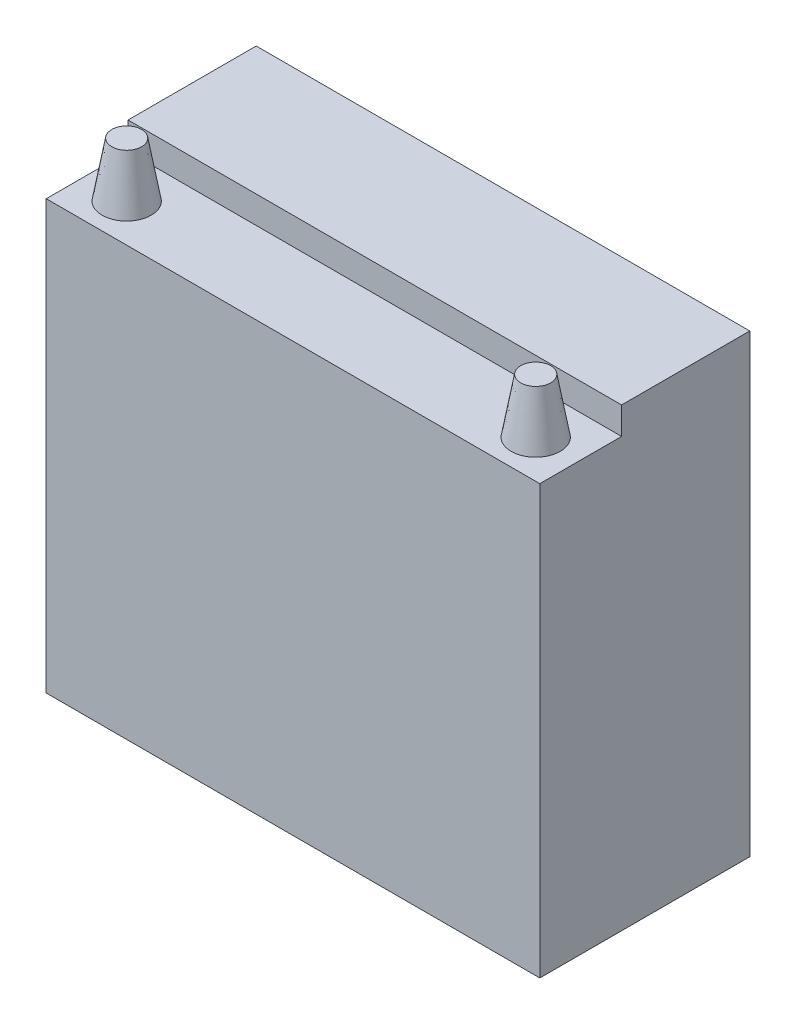
ISO-10303-21;
HEADER;
FILE_DESCRIPTION(('STEP AP214'),'2;1');
FILE_NAME('part.step','',(''),(''),'','','');
FILE_SCHEMA(('AUTOMOTIVE_DESIGN { 1 0 10303 214 1 1 1 1 }'));
ENDSEC;
DATA;
#1=APPLICATION_CONTEXT('core data for automotive mechanical design processes');
#2=APPLICATION_PROTOCOL_DEFINITION('international standard','automotive_design',2000,#1);
#3=PRODUCT_CONTEXT('',#1,'mechanical');
#4=PRODUCT('Part','Part','',(#3));
#5=PRODUCT_RELATED_PRODUCT_CATEGORY('part','',(#4));
#6=PRODUCT_DEFINITION_FORMATION('','',#4);
#7=PRODUCT_DEFINITION_CONTEXT('part definition',#1,'design');
#8=PRODUCT_DEFINITION('design','',#6,#7);
#9=PRODUCT_DEFINITION_SHAPE('','',#8);
#10=(LENGTH_UNIT() NAMED_UNIT(*) SI_UNIT(.MILLI.,.METRE.));
#11=(NAMED_UNIT(*) PLANE_ANGLE_UNIT() SI_UNIT($,.RADIAN.));
#12=(NAMED_UNIT(*) SI_UNIT($,.STERADIAN.) SOLID_ANGLE_UNIT());
#13=UNCERTAINTY_MEASURE_WITH_UNIT(LENGTH_MEASURE(1.E-05),#10,'distance_accuracy_value','');
#14=(GEOMETRIC_REPRESENTATION_CONTEXT(3) GLOBAL_UNCERTAINTY_ASSIGNED_CONTEXT((#13)) GLOBAL_UNIT_ASSIGNED_CONTEXT((#10,
#11,#12)) REPRESENTATION_CONTEXT('',''));
#15=CARTESIAN_POINT('',(0.,0.,0.));
#16=DIRECTION('',(0.,0.,1.));
#17=DIRECTION('',(1.,0.,0.));
#18=AXIS2_PLACEMENT_3D('',#15,#16,#17);
#19=CARTESIAN_POINT('',(-77.,167.,31.8307086614173));
#20=DIRECTION('',(1.,0.,0.));
#21=DIRECTION('',(0.,0.,-1.));
#22=AXIS2_PLACEMENT_3D('',#19,#20,#21);
#23=PLANE('',#22);
#24=DIRECTION('',(0.,0.,1.));
#25=VECTOR('',#24,1.);
#26=CARTESIAN_POINT('',(-77.,157.,31.8307086614173));
#27=LINE('',#26,#25);
#28=CARTESIAN_POINT('',(-77.,157.,1.83070866141732));
#29=VERTEX_POINT('',#28);
#30=CARTESIAN_POINT('',(-77.,157.,31.8307086614173));
#31=VERTEX_POINT('',#30);
#32=EDGE_CURVE('E127',#29,#31,#27,.T.);
#33=ORIENTED_EDGE('',*,*,#32,.F.);
#34=DIRECTION('',(0.,1.,0.));
#35=VECTOR('',#34,1.);
#36=CARTESIAN_POINT('',(-77.,157.,1.83070866141732));
#37=LINE('',#36,#35);
#38=CARTESIAN_POINT('',(-77.,167.,1.83070866141732));
#39=VERTEX_POINT('',#38);
#40=EDGE_CURVE('E100',#29,#39,#37,.T.);
#41=ORIENTED_EDGE('',*,*,#40,.T.);
#42=DIRECTION('',(0.,0.,1.));
#43=VECTOR('',#42,1.);
#44=CARTESIAN_POINT('',(-77.,167.,31.8307086614173));
#45=LINE('',#44,#43);
#46=CARTESIAN_POINT('',(-77.,167.,-45.1692913385827));
#47=VERTEX_POINT('',#46);
#48=EDGE_CURVE('E86',#47,#39,#45,.T.);
#49=ORIENTED_EDGE('',*,*,#48,.F.);
#50=DIRECTION('',(0.,-1.,0.));
#51=VECTOR('',#50,1.);
#52=CARTESIAN_POINT('',(-77.,167.,-45.1692913385827));
#53=LINE('',#52,#51);
#54=CARTESIAN_POINT('',(-77.,0.,-45.1692913385827));
#55=VERTEX_POINT('',#54);
#56=EDGE_CURVE('E79',#47,#55,#53,.T.);
#57=ORIENTED_EDGE('',*,*,#56,.T.);
#58=DIRECTION('',(0.,0.,1.));
#59=VECTOR('',#58,1.);
#60=CARTESIAN_POINT('',(-77.,0.,31.8307086614173));
#61=LINE('',#60,#59);
#62=CARTESIAN_POINT('',(-77.,0.,31.8307086614173));
#63=VERTEX_POINT('',#62);
#64=EDGE_CURVE('E93',#55,#63,#61,.T.);
#65=ORIENTED_EDGE('',*,*,#64,.T.);
#66=DIRECTION('',(0.,-1.,0.));
#67=VECTOR('',#66,1.);
#68=CARTESIAN_POINT('',(-77.,167.,31.8307086614173));
#69=LINE('',#68,#67);
#70=EDGE_CURVE('E111',#31,#63,#69,.T.);
#71=ORIENTED_EDGE('',*,*,#70,.F.);
#72=EDGE_LOOP('',(#33,#41,#49,#57,#65,#71));
#73=FACE_BOUND('',#72,.T.);
#74=ADVANCED_FACE('F34',(#73),#23,.F.);
#75=CARTESIAN_POINT('',(-77.,167.,31.8307086614173));
#76=DIRECTION('',(0.,0.,-1.));
#77=DIRECTION('',(-1.,0.,0.));
#78=AXIS2_PLACEMENT_3D('',#75,#76,#77);
#79=PLANE('',#78);
#80=DIRECTION('',(0.,-1.,0.));
#81=VECTOR('',#80,1.);
#82=CARTESIAN_POINT('',(104.,167.,31.8307086614173));
#83=LINE('',#82,#81);
#84=CARTESIAN_POINT('',(104.,157.,31.8307086614173));
#85=VERTEX_POINT('',#84);
#86=CARTESIAN_POINT('',(104.,0.,31.8307086614173));
#87=VERTEX_POINT('',#86);
#88=EDGE_CURVE('E109',#85,#87,#83,.T.);
#89=ORIENTED_EDGE('',*,*,#88,.F.);
#90=DIRECTION('',(1.,0.,0.));
#91=VECTOR('',#90,1.);
#92=CARTESIAN_POINT('',(-77.,157.,31.8307086614173));
#93=LINE('',#92,#91);
#94=EDGE_CURVE('E131',#31,#85,#93,.T.);
#95=ORIENTED_EDGE('',*,*,#94,.F.);
#96=ORIENTED_EDGE('',*,*,#70,.T.);
#97=DIRECTION('',(1.,0.,0.));
#98=VECTOR('',#97,1.);
#99=CARTESIAN_POINT('',(-77.,0.,31.8307086614173));
#100=LINE('',#99,#98);
#101=EDGE_CURVE('E99',#63,#87,#100,.T.);
#102=ORIENTED_EDGE('',*,*,#101,.T.);
#103=EDGE_LOOP('',(#89,#95,#96,#102));
#104=FACE_BOUND('',#103,.T.);
#105=ADVANCED_FACE('F140',(#104),#79,.F.);
#106=CARTESIAN_POINT('',(104.,167.,31.8307086614173));
#107=DIRECTION('',(-1.,0.,0.));
#108=DIRECTION('',(0.,0.,1.));
#109=AXIS2_PLACEMENT_3D('',#106,#107,#108);
#110=PLANE('',#109);
#111=DIRECTION('',(0.,0.,-1.));
#112=VECTOR('',#111,1.);
#113=CARTESIAN_POINT('',(104.,167.,31.8307086614173));
#114=LINE('',#113,#112);
#115=CARTESIAN_POINT('',(104.,167.,1.83070866141732));
#116=VERTEX_POINT('',#115);
#117=CARTESIAN_POINT('',(104.,167.,-45.1692913385827));
#118=VERTEX_POINT('',#117);
#119=EDGE_CURVE('E150',#116,#118,#114,.T.);
#120=ORIENTED_EDGE('',*,*,#119,.F.);
#121=DIRECTION('',(0.,1.,0.));
#122=VECTOR('',#121,1.);
#123=CARTESIAN_POINT('',(104.,157.,1.83070866141732));
#124=LINE('',#123,#122);
#125=CARTESIAN_POINT('',(104.,157.,1.83070866141732));
#126=VERTEX_POINT('',#125);
#127=EDGE_CURVE('E48',#126,#116,#124,.T.);
#128=ORIENTED_EDGE('',*,*,#127,.F.);
#129=DIRECTION('',(0.,0.,-1.));
#130=VECTOR('',#129,1.);
#131=CARTESIAN_POINT('',(104.,157.,31.8307086614173));
#132=LINE('',#131,#130);
#133=EDGE_CURVE('E141',#85,#126,#132,.T.);
#134=ORIENTED_EDGE('',*,*,#133,.F.);
#135=ORIENTED_EDGE('',*,*,#88,.T.);
#136=DIRECTION('',(0.,0.,-1.));
#137=VECTOR('',#136,1.);
#138=CARTESIAN_POINT('',(104.,0.,31.8307086614173));
#139=LINE('',#138,#137);
#140=CARTESIAN_POINT('',(104.,0.,-45.1692913385827));
#141=VERTEX_POINT('',#140);
#142=EDGE_CURVE('E87',#87,#141,#139,.T.);
#143=ORIENTED_EDGE('',*,*,#142,.T.);
#144=DIRECTION('',(0.,-1.,0.));
#145=VECTOR('',#144,1.);
#146=CARTESIAN_POINT('',(104.,167.,-45.1692913385827));
#147=LINE('',#146,#145);
#148=EDGE_CURVE('E82',#118,#141,#147,.T.);
#149=ORIENTED_EDGE('',*,*,#148,.F.);
#150=EDGE_LOOP('',(#120,#128,#134,#135,#143,#149));
#151=FACE_BOUND('',#150,.T.);
#152=ADVANCED_FACE('F154',(#151),#110,.F.);
#153=CARTESIAN_POINT('',(-77.,167.,-45.1692913385827));
#154=DIRECTION('',(0.,0.,1.));
#155=DIRECTION('',(1.,0.,0.));
#156=AXIS2_PLACEMENT_3D('',#153,#154,#155);
#157=PLANE('',#156);
#158=DIRECTION('',(-1.,0.,0.));
#159=VECTOR('',#158,1.);
#160=CARTESIAN_POINT('',(-77.,0.,-45.1692913385827));
#161=LINE('',#160,#159);
#162=EDGE_CURVE('E76',#141,#55,#161,.T.);
#163=ORIENTED_EDGE('',*,*,#162,.T.);
#164=ORIENTED_EDGE('',*,*,#56,.F.);
#165=DIRECTION('',(-1.,0.,0.));
#166=VECTOR('',#165,1.);
#167=CARTESIAN_POINT('',(-77.,167.,-45.1692913385827));
#168=LINE('',#167,#166);
#169=EDGE_CURVE('E57',#118,#47,#168,.T.);
#170=ORIENTED_EDGE('',*,*,#169,.F.);
#171=ORIENTED_EDGE('',*,*,#148,.T.);
#172=EDGE_LOOP('',(#163,#164,#170,#171));
#173=FACE_BOUND('',#172,.T.);
#174=ADVANCED_FACE('F78',(#173),#157,.F.);
#175=CARTESIAN_POINT('',(0.,167.,0.));
#176=DIRECTION('',(0.,-1.,0.));
#177=DIRECTION('',(0.,0.,-1.));
#178=AXIS2_PLACEMENT_3D('',#175,#176,#177);
#179=PLANE('',#178);
#180=ORIENTED_EDGE('',*,*,#48,.T.);
#181=DIRECTION('',(-1.,0.,0.));
#182=VECTOR('',#181,1.);
#183=CARTESIAN_POINT('',(-77.,167.,1.83070866141732));
#184=LINE('',#183,#182);
#185=EDGE_CURVE('E136',#116,#39,#184,.T.);
#186=ORIENTED_EDGE('',*,*,#185,.F.);
#187=ORIENTED_EDGE('',*,*,#119,.T.);
#188=ORIENTED_EDGE('',*,*,#169,.T.);
#189=EDGE_LOOP('',(#180,#186,#187,#188));
#190=FACE_BOUND('',#189,.T.);
#191=ADVANCED_FACE('F152',(#190),#179,.F.);
#192=CARTESIAN_POINT('',(0.,0.,0.));
#193=DIRECTION('',(0.,-1.,0.));
#194=DIRECTION('',(0.,0.,-1.));
#195=AXIS2_PLACEMENT_3D('',#192,#193,#194);
#196=PLANE('',#195);
#197=ORIENTED_EDGE('',*,*,#64,.F.);
#198=ORIENTED_EDGE('',*,*,#162,.F.);
#199=ORIENTED_EDGE('',*,*,#142,.F.);
#200=ORIENTED_EDGE('',*,*,#101,.F.);
#201=EDGE_LOOP('',(#197,#198,#199,#200));
#202=FACE_BOUND('',#201,.T.);
#203=ADVANCED_FACE('F97',(#202),#196,.T.);
#204=CARTESIAN_POINT('',(-77.,157.,1.83070866141732));
#205=DIRECTION('',(0.,0.,-1.));
#206=DIRECTION('',(-1.,0.,0.));
#207=AXIS2_PLACEMENT_3D('',#204,#205,#206);
#208=PLANE('',#207);
#209=ORIENTED_EDGE('',*,*,#185,.T.);
#210=ORIENTED_EDGE('',*,*,#40,.F.);
#211=DIRECTION('',(-1.,0.,0.));
#212=VECTOR('',#211,1.);
#213=CARTESIAN_POINT('',(-77.,157.,1.83070866141732));
#214=LINE('',#213,#212);
#215=EDGE_CURVE('E133',#126,#29,#214,.T.);
#216=ORIENTED_EDGE('',*,*,#215,.F.);
#217=ORIENTED_EDGE('',*,*,#127,.T.);
#218=EDGE_LOOP('',(#209,#210,#216,#217));
#219=FACE_BOUND('',#218,.T.);
#220=ADVANCED_FACE('F120',(#219),#208,.F.);
#221=CARTESIAN_POINT('',(0.,157.,0.));
#222=DIRECTION('',(0.,-1.,0.));
#223=DIRECTION('',(0.,0.,-1.));
#224=AXIS2_PLACEMENT_3D('',#221,#222,#223);
#225=PLANE('',#224);
#226=CARTESIAN_POINT('',(88.5,157.,17.8307086614173));
#227=DIRECTION('',(0.,-1.,0.));
#228=DIRECTION('',(0.,0.,-1.));
#229=AXIS2_PLACEMENT_3D('',#226,#227,#228);
#230=CIRCLE('',#229,9.00000000000001);
#231=CARTESIAN_POINT('',(88.5,157.,8.83070866141731));
#232=VERTEX_POINT('',#231);
#233=EDGE_CURVE('E11',#232,#232,#230,.F.);
#234=ORIENTED_EDGE('',*,*,#233,.F.);
#235=EDGE_LOOP('',(#234));
#236=FACE_BOUND('',#235,.T.);
#237=CARTESIAN_POINT('',(-61.5,157.,17.8307086614173));
#238=DIRECTION('',(0.,-1.,0.));
#239=DIRECTION('',(0.,0.,-1.));
#240=AXIS2_PLACEMENT_3D('',#237,#238,#239);
#241=CIRCLE('',#240,9.);
#242=CARTESIAN_POINT('',(-61.5,157.,8.83070866141732));
#243=VERTEX_POINT('',#242);
#244=EDGE_CURVE('E41',#243,#243,#241,.F.);
#245=ORIENTED_EDGE('',*,*,#244,.F.);
#246=EDGE_LOOP('',(#245));
#247=FACE_BOUND('',#246,.T.);
#248=ORIENTED_EDGE('',*,*,#32,.T.);
#249=ORIENTED_EDGE('',*,*,#94,.T.);
#250=ORIENTED_EDGE('',*,*,#133,.T.);
#251=ORIENTED_EDGE('',*,*,#215,.T.);
#252=EDGE_LOOP('',(#248,#249,#250,#251));
#253=FACE_BOUND('',#252,.T.);
#254=ADVANCED_FACE('F117',(#236,#247,#253),#225,.F.);
#255=CARTESIAN_POINT('',(-61.5,157.,17.8307086614173));
#256=DIRECTION('',(0.,-1.,0.));
#257=DIRECTION('',(0.,0.,1.));
#258=AXIS2_PLACEMENT_3D('',#255,#256,#257);
#259=CONICAL_SURFACE('',#258,9.,0.174532925199433);
#260=CARTESIAN_POINT('',(-61.5,177.,17.8307086614173));
#261=DIRECTION('',(0.,1.,0.));
#262=DIRECTION('',(0.,0.,1.));
#263=AXIS2_PLACEMENT_3D('',#260,#261,#262);
#264=CIRCLE('',#263,5.47346038583071);
#265=CARTESIAN_POINT('',(-61.5,177.,23.304169047248));
#266=VERTEX_POINT('',#265);
#267=EDGE_CURVE('E147',#266,#266,#264,.T.);
#268=ORIENTED_EDGE('',*,*,#267,.F.);
#269=EDGE_LOOP('',(#268));
#270=FACE_BOUND('',#269,.T.);
#271=ORIENTED_EDGE('',*,*,#244,.T.);
#272=EDGE_LOOP('',(#271));
#273=FACE_BOUND('',#272,.T.);
#274=ADVANCED_FACE('F115',(#270,#273),#259,.T.);
#275=CARTESIAN_POINT('',(-61.5,177.,17.8307086614173));
#276=DIRECTION('',(0.,1.,0.));
#277=DIRECTION('',(0.,0.,1.));
#278=AXIS2_PLACEMENT_3D('',#275,#276,#277);
#279=PLANE('',#278);
#280=ORIENTED_EDGE('',*,*,#267,.T.);
#281=EDGE_LOOP('',(#280));
#282=FACE_BOUND('',#281,.T.);
#283=ADVANCED_FACE('F227',(#282),#279,.T.);
#284=CARTESIAN_POINT('',(88.5,157.,17.8307086614173));
#285=DIRECTION('',(0.,-1.,0.));
#286=DIRECTION('',(0.,0.,1.));
#287=AXIS2_PLACEMENT_3D('',#284,#285,#286);
#288=CONICAL_SURFACE('',#287,9.00000000000001,0.174532925199433);
#289=CARTESIAN_POINT('',(88.5,177.,17.8307086614173));
#290=DIRECTION('',(0.,1.,0.));
#291=DIRECTION('',(0.,0.,1.));
#292=AXIS2_PLACEMENT_3D('',#289,#290,#291);
#293=CIRCLE('',#292,5.47346038583071);
#294=CARTESIAN_POINT('',(88.5,177.,23.304169047248));
#295=VERTEX_POINT('',#294);
#296=EDGE_CURVE('E264',#295,#295,#293,.T.);
#297=ORIENTED_EDGE('',*,*,#296,.F.);
#298=EDGE_LOOP('',(#297));
#299=FACE_BOUND('',#298,.T.);
#300=ORIENTED_EDGE('',*,*,#233,.T.);
#301=EDGE_LOOP('',(#300));
#302=FACE_BOUND('',#301,.T.);
#303=ADVANCED_FACE('F236',(#299,#302),#288,.T.);
#304=CARTESIAN_POINT('',(88.5,177.,17.8307086614173));
#305=DIRECTION('',(0.,1.,0.));
#306=DIRECTION('',(0.,0.,1.));
#307=AXIS2_PLACEMENT_3D('',#304,#305,#306);
#308=PLANE('',#307);
#309=ORIENTED_EDGE('',*,*,#296,.T.);
#310=EDGE_LOOP('',(#309));
#311=FACE_BOUND('',#310,.T.);
#312=ADVANCED_FACE('F245',(#311),#308,.T.);
#313=CLOSED_SHELL('',(#74,#105,#152,#174,#191,#203,#220,#254,#274,#283,#303,#312));
#314=MANIFOLD_SOLID_BREP('B2',#313);
#315=ADVANCED_BREP_SHAPE_REPRESENTATION('',(#18,#314),#14);
#316=SHAPE_DEFINITION_REPRESENTATION(#9,#315);
ENDSEC;
END-ISO-10303-21;
